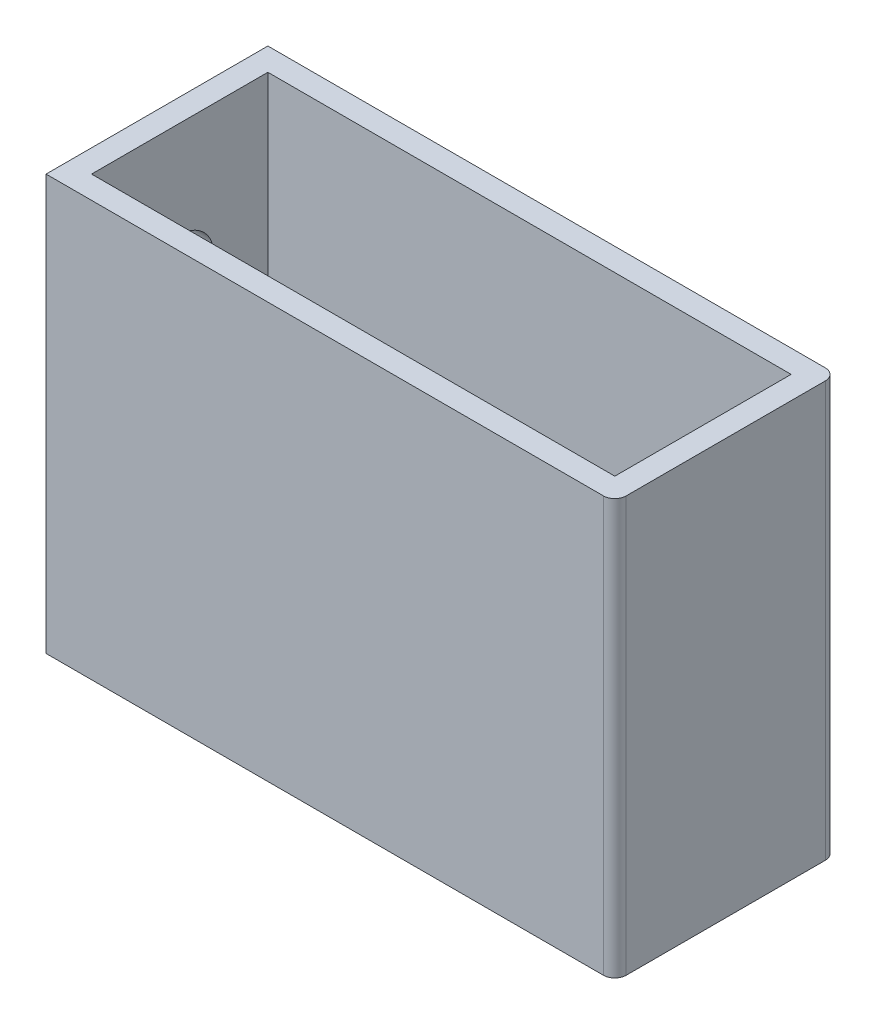
ISO-10303-21;
HEADER;
FILE_DESCRIPTION(('STEP AP214'),'2;1');
FILE_NAME('part.step','',(''),(''),'','','');
FILE_SCHEMA(('AUTOMOTIVE_DESIGN { 1 0 10303 214 1 1 1 1 }'));
ENDSEC;
DATA;
#1=APPLICATION_CONTEXT('core data for automotive mechanical design processes');
#2=APPLICATION_PROTOCOL_DEFINITION('international standard','automotive_design',2000,#1);
#3=PRODUCT_CONTEXT('',#1,'mechanical');
#4=PRODUCT('Part','Part','',(#3));
#5=PRODUCT_RELATED_PRODUCT_CATEGORY('part','',(#4));
#6=PRODUCT_DEFINITION_FORMATION('','',#4);
#7=PRODUCT_DEFINITION_CONTEXT('part definition',#1,'design');
#8=PRODUCT_DEFINITION('design','',#6,#7);
#9=PRODUCT_DEFINITION_SHAPE('','',#8);
#10=(LENGTH_UNIT() NAMED_UNIT(*) SI_UNIT(.MILLI.,.METRE.));
#11=(NAMED_UNIT(*) PLANE_ANGLE_UNIT() SI_UNIT($,.RADIAN.));
#12=(NAMED_UNIT(*) SI_UNIT($,.STERADIAN.) SOLID_ANGLE_UNIT());
#13=UNCERTAINTY_MEASURE_WITH_UNIT(LENGTH_MEASURE(1.E-05),#10,'distance_accuracy_value','');
#14=(GEOMETRIC_REPRESENTATION_CONTEXT(3) GLOBAL_UNCERTAINTY_ASSIGNED_CONTEXT((#13)) GLOBAL_UNIT_ASSIGNED_CONTEXT((#10,
#11,#12)) REPRESENTATION_CONTEXT('',''));
#15=CARTESIAN_POINT('',(0.,0.,0.));
#16=DIRECTION('',(0.,0.,1.));
#17=DIRECTION('',(1.,0.,0.));
#18=AXIS2_PLACEMENT_3D('',#15,#16,#17);
#19=CARTESIAN_POINT('',(0.,3.,0.));
#20=DIRECTION('',(0.,1.,0.));
#21=DIRECTION('',(0.,0.,1.));
#22=AXIS2_PLACEMENT_3D('',#19,#20,#21);
#23=PLANE('',#22);
#24=DIRECTION('',(0.,0.,-1.));
#25=VECTOR('',#24,1.);
#26=CARTESIAN_POINT('',(-1.64,3.,15.5));
#27=LINE('',#26,#25);
#28=CARTESIAN_POINT('',(-1.64,2.99999999999995,7.08));
#29=VERTEX_POINT('',#28);
#30=CARTESIAN_POINT('',(-1.64,3.,-15.5));
#31=VERTEX_POINT('',#30);
#32=EDGE_CURVE('E187',#29,#31,#27,.T.);
#33=ORIENTED_EDGE('',*,*,#32,.F.);
#34=DIRECTION('',(1.,0.,0.));
#35=VECTOR('',#34,1.);
#36=CARTESIAN_POINT('',(-2.14000000000001,2.99999999999995,7.08));
#37=LINE('',#36,#35);
#38=CARTESIAN_POINT('',(38.86,2.99999999999995,7.08));
#39=VERTEX_POINT('',#38);
#40=EDGE_CURVE('E171',#29,#39,#37,.T.);
#41=ORIENTED_EDGE('',*,*,#40,.T.);
#42=DIRECTION('',(0.,0.,1.));
#43=VECTOR('',#42,1.);
#44=CARTESIAN_POINT('',(38.86,3.,15.5));
#45=LINE('',#44,#43);
#46=CARTESIAN_POINT('',(38.86,3.,-15.5));
#47=VERTEX_POINT('',#46);
#48=EDGE_CURVE('E185',#47,#39,#45,.T.);
#49=ORIENTED_EDGE('',*,*,#48,.F.);
#50=DIRECTION('',(1.,0.,0.));
#51=VECTOR('',#50,1.);
#52=CARTESIAN_POINT('',(0.,3.,-15.5));
#53=LINE('',#52,#51);
#54=EDGE_CURVE('E251',#31,#47,#53,.T.);
#55=ORIENTED_EDGE('',*,*,#54,.F.);
#56=EDGE_LOOP('',(#33,#41,#49,#55));
#57=FACE_BOUND('',#56,.T.);
#58=ADVANCED_FACE('F37',(#57),#23,.T.);
#59=DIRECTION('',(-1.,0.,0.));
#60=VECTOR('',#59,1.);
#61=CARTESIAN_POINT('',(46.,2.99999999999995,9.93103564978526));
#62=LINE('',#61,#60);
#63=CARTESIAN_POINT('',(46.,2.99999999999995,9.93103564978526));
#64=VERTEX_POINT('',#63);
#65=CARTESIAN_POINT('',(-8.78,2.99999999999995,9.93103564978526));
#66=VERTEX_POINT('',#65);
#67=EDGE_CURVE('E469',#64,#66,#62,.T.);
#68=ORIENTED_EDGE('',*,*,#67,.T.);
#69=DIRECTION('',(0.,0.,1.));
#70=VECTOR('',#69,1.);
#71=CARTESIAN_POINT('',(-8.78,3.,15.5));
#72=LINE('',#71,#70);
#73=CARTESIAN_POINT('',(-8.78,3.,-15.5));
#74=VERTEX_POINT('',#73);
#75=EDGE_CURVE('E443',#74,#66,#72,.T.);
#76=ORIENTED_EDGE('',*,*,#75,.F.);
#77=CARTESIAN_POINT('',(-46.,3.,-15.5));
#78=VERTEX_POINT('',#77);
#79=EDGE_CURVE('E252',#78,#74,#53,.T.);
#80=ORIENTED_EDGE('',*,*,#79,.F.);
#81=DIRECTION('',(0.,0.,1.));
#82=VECTOR('',#81,1.);
#83=CARTESIAN_POINT('',(-46.,3.,0.));
#84=LINE('',#83,#82);
#85=CARTESIAN_POINT('',(-46.,3.,15.5));
#86=VERTEX_POINT('',#85);
#87=EDGE_CURVE('E254',#78,#86,#84,.T.);
#88=ORIENTED_EDGE('',*,*,#87,.T.);
#89=DIRECTION('',(1.,0.,0.));
#90=VECTOR('',#89,1.);
#91=CARTESIAN_POINT('',(0.,3.,15.5));
#92=LINE('',#91,#90);
#93=CARTESIAN_POINT('',(46.,2.99999999999995,15.5));
#94=VERTEX_POINT('',#93);
#95=EDGE_CURVE('E256',#86,#94,#92,.T.);
#96=ORIENTED_EDGE('',*,*,#95,.T.);
#97=DIRECTION('',(0.,0.,-1.));
#98=VECTOR('',#97,1.);
#99=CARTESIAN_POINT('',(46.,2.99999999999995,15.5));
#100=LINE('',#99,#98);
#101=EDGE_CURVE('E464',#94,#64,#100,.T.);
#102=ORIENTED_EDGE('',*,*,#101,.T.);
#103=EDGE_LOOP('',(#68,#76,#80,#88,#96,#102));
#104=FACE_BOUND('',#103,.T.);
#105=ADVANCED_FACE('F312',(#104),#23,.T.);
#106=CARTESIAN_POINT('',(38.86,31.,15.5));
#107=DIRECTION('',(1.,0.,0.));
#108=DIRECTION('',(0.,0.,-1.));
#109=AXIS2_PLACEMENT_3D('',#106,#107,#108);
#110=PLANE('',#109);
#111=DIRECTION('',(0.,-1.,0.));
#112=VECTOR('',#111,1.);
#113=CARTESIAN_POINT('',(38.86,35.,7.08));
#114=LINE('',#113,#112);
#115=CARTESIAN_POINT('',(38.86,31.,7.08));
#116=VERTEX_POINT('',#115);
#117=EDGE_CURVE('E167',#116,#39,#114,.T.);
#118=ORIENTED_EDGE('',*,*,#117,.F.);
#119=DIRECTION('',(0.,0.,1.));
#120=VECTOR('',#119,1.);
#121=CARTESIAN_POINT('',(38.86,31.,15.5));
#122=LINE('',#121,#120);
#123=CARTESIAN_POINT('',(38.86,31.,-15.5));
#124=VERTEX_POINT('',#123);
#125=EDGE_CURVE('E201',#124,#116,#122,.T.);
#126=ORIENTED_EDGE('',*,*,#125,.F.);
#127=DIRECTION('',(0.,-1.,0.));
#128=VECTOR('',#127,1.);
#129=CARTESIAN_POINT('',(38.86,31.,-15.5));
#130=LINE('',#129,#128);
#131=EDGE_CURVE('E191',#124,#47,#130,.T.);
#132=ORIENTED_EDGE('',*,*,#131,.T.);
#133=ORIENTED_EDGE('',*,*,#48,.T.);
#134=EDGE_LOOP('',(#118,#126,#132,#133));
#135=FACE_BOUND('',#134,.T.);
#136=ADVANCED_FACE('F190',(#135),#110,.F.);
#137=CARTESIAN_POINT('',(-1.64,31.,15.5));
#138=DIRECTION('',(-1.,0.,0.));
#139=DIRECTION('',(0.,0.,1.));
#140=AXIS2_PLACEMENT_3D('',#137,#138,#139);
#141=PLANE('',#140);
#142=DIRECTION('',(0.,1.,0.));
#143=VECTOR('',#142,1.);
#144=CARTESIAN_POINT('',(-1.64,31.,7.08));
#145=LINE('',#144,#143);
#146=CARTESIAN_POINT('',(-1.64,31.,7.08));
#147=VERTEX_POINT('',#146);
#148=EDGE_CURVE('E188',#29,#147,#145,.T.);
#149=ORIENTED_EDGE('',*,*,#148,.F.);
#150=ORIENTED_EDGE('',*,*,#32,.T.);
#151=DIRECTION('',(0.,-1.,0.));
#152=VECTOR('',#151,1.);
#153=CARTESIAN_POINT('',(-1.64,31.,-15.5));
#154=LINE('',#153,#152);
#155=CARTESIAN_POINT('',(-1.64,31.,-15.5));
#156=VERTEX_POINT('',#155);
#157=EDGE_CURVE('E451',#156,#31,#154,.T.);
#158=ORIENTED_EDGE('',*,*,#157,.F.);
#159=DIRECTION('',(0.,0.,-1.));
#160=VECTOR('',#159,1.);
#161=CARTESIAN_POINT('',(-1.64,31.,15.5));
#162=LINE('',#161,#160);
#163=EDGE_CURVE('E59',#147,#156,#162,.T.);
#164=ORIENTED_EDGE('',*,*,#163,.F.);
#165=EDGE_LOOP('',(#149,#150,#158,#164));
#166=FACE_BOUND('',#165,.T.);
#167=ADVANCED_FACE('F335',(#166),#141,.F.);
#168=CARTESIAN_POINT('',(-46.,73.,-15.5));
#169=DIRECTION('',(0.,0.,1.));
#170=DIRECTION('',(1.,0.,0.));
#171=AXIS2_PLACEMENT_3D('',#168,#169,#170);
#172=PLANE('',#171);
#173=DIRECTION('',(-1.,0.,0.));
#174=VECTOR('',#173,1.);
#175=CARTESIAN_POINT('',(-1.64,31.,-15.5));
#176=LINE('',#175,#174);
#177=CARTESIAN_POINT('',(-8.78,31.,-15.5));
#178=VERTEX_POINT('',#177);
#179=EDGE_CURVE('E442',#156,#178,#176,.T.);
#180=ORIENTED_EDGE('',*,*,#179,.F.);
#181=ORIENTED_EDGE('',*,*,#157,.T.);
#182=ORIENTED_EDGE('',*,*,#54,.T.);
#183=ORIENTED_EDGE('',*,*,#131,.F.);
#184=DIRECTION('',(-1.,0.,0.));
#185=VECTOR('',#184,1.);
#186=CARTESIAN_POINT('',(46.,31.,-15.5));
#187=LINE('',#186,#185);
#188=CARTESIAN_POINT('',(46.,31.,-15.5));
#189=VERTEX_POINT('',#188);
#190=EDGE_CURVE('E195',#189,#124,#187,.T.);
#191=ORIENTED_EDGE('',*,*,#190,.F.);
#192=DIRECTION('',(0.,-1.,0.));
#193=VECTOR('',#192,1.);
#194=CARTESIAN_POINT('',(46.,73.,-15.5));
#195=LINE('',#194,#193);
#196=CARTESIAN_POINT('',(46.,73.,-15.5));
#197=VERTEX_POINT('',#196);
#198=EDGE_CURVE('E213',#197,#189,#195,.T.);
#199=ORIENTED_EDGE('',*,*,#198,.F.);
#200=DIRECTION('',(-1.,0.,0.));
#201=VECTOR('',#200,1.);
#202=CARTESIAN_POINT('',(-46.,73.,-15.5));
#203=LINE('',#202,#201);
#204=CARTESIAN_POINT('',(-46.,73.,-15.5));
#205=VERTEX_POINT('',#204);
#206=EDGE_CURVE('E204',#197,#205,#203,.T.);
#207=ORIENTED_EDGE('',*,*,#206,.T.);
#208=DIRECTION('',(0.,-1.,0.));
#209=VECTOR('',#208,1.);
#210=CARTESIAN_POINT('',(-46.,73.,-15.5));
#211=LINE('',#210,#209);
#212=EDGE_CURVE('E222',#205,#78,#211,.T.);
#213=ORIENTED_EDGE('',*,*,#212,.T.);
#214=ORIENTED_EDGE('',*,*,#79,.T.);
#215=DIRECTION('',(0.,-1.,0.));
#216=VECTOR('',#215,1.);
#217=CARTESIAN_POINT('',(-8.78,31.,-15.5));
#218=LINE('',#217,#216);
#219=EDGE_CURVE('E52',#178,#74,#218,.T.);
#220=ORIENTED_EDGE('',*,*,#219,.F.);
#221=EDGE_LOOP('',(#180,#181,#182,#183,#191,#199,#207,#213,#214,#220));
#222=FACE_BOUND('',#221,.T.);
#223=ADVANCED_FACE('F331',(#222),#172,.T.);
#224=CARTESIAN_POINT('',(-46.,73.,15.5));
#225=DIRECTION('',(0.,0.,-1.));
#226=DIRECTION('',(-1.,0.,0.));
#227=AXIS2_PLACEMENT_3D('',#224,#225,#226);
#228=PLANE('',#227);
#229=DIRECTION('',(0.,-1.,0.));
#230=VECTOR('',#229,1.);
#231=CARTESIAN_POINT('',(46.,73.,15.5));
#232=LINE('',#231,#230);
#233=CARTESIAN_POINT('',(46.,73.,15.5));
#234=VERTEX_POINT('',#233);
#235=EDGE_CURVE('E216',#234,#94,#232,.T.);
#236=ORIENTED_EDGE('',*,*,#235,.T.);
#237=ORIENTED_EDGE('',*,*,#95,.F.);
#238=DIRECTION('',(0.,-1.,0.));
#239=VECTOR('',#238,1.);
#240=CARTESIAN_POINT('',(-46.,73.,15.5));
#241=LINE('',#240,#239);
#242=CARTESIAN_POINT('',(-46.,73.,15.5));
#243=VERTEX_POINT('',#242);
#244=EDGE_CURVE('E219',#243,#86,#241,.T.);
#245=ORIENTED_EDGE('',*,*,#244,.F.);
#246=DIRECTION('',(1.,0.,0.));
#247=VECTOR('',#246,1.);
#248=CARTESIAN_POINT('',(-46.,73.,15.5));
#249=LINE('',#248,#247);
#250=EDGE_CURVE('E208',#243,#234,#249,.T.);
#251=ORIENTED_EDGE('',*,*,#250,.T.);
#252=EDGE_LOOP('',(#236,#237,#245,#251));
#253=FACE_BOUND('',#252,.T.);
#254=ADVANCED_FACE('F334',(#253),#228,.T.);
#255=CARTESIAN_POINT('',(46.,73.,-15.5));
#256=DIRECTION('',(-1.,0.,0.));
#257=DIRECTION('',(0.,0.,1.));
#258=AXIS2_PLACEMENT_3D('',#255,#256,#257);
#259=PLANE('',#258);
#260=DIRECTION('',(0.,0.,-1.));
#261=VECTOR('',#260,1.);
#262=CARTESIAN_POINT('',(46.,35.,0.));
#263=LINE('',#262,#261);
#264=CARTESIAN_POINT('',(46.,35.,9.93103564978525));
#265=VERTEX_POINT('',#264);
#266=CARTESIAN_POINT('',(46.,35.,7.08));
#267=VERTEX_POINT('',#266);
#268=EDGE_CURVE('E474',#265,#267,#263,.T.);
#269=ORIENTED_EDGE('',*,*,#268,.F.);
#270=DIRECTION('',(0.,-1.,0.));
#271=VECTOR('',#270,1.);
#272=CARTESIAN_POINT('',(46.,35.,9.93103564978526));
#273=LINE('',#272,#271);
#274=EDGE_CURVE('E193',#265,#64,#273,.T.);
#275=ORIENTED_EDGE('',*,*,#274,.T.);
#276=ORIENTED_EDGE('',*,*,#101,.F.);
#277=ORIENTED_EDGE('',*,*,#235,.F.);
#278=DIRECTION('',(0.,0.,-1.));
#279=VECTOR('',#278,1.);
#280=CARTESIAN_POINT('',(46.,73.,-15.5));
#281=LINE('',#280,#279);
#282=EDGE_CURVE('E211',#234,#197,#281,.T.);
#283=ORIENTED_EDGE('',*,*,#282,.T.);
#284=ORIENTED_EDGE('',*,*,#198,.T.);
#285=DIRECTION('',(0.,0.,-1.));
#286=VECTOR('',#285,1.);
#287=CARTESIAN_POINT('',(46.,31.,15.5));
#288=LINE('',#287,#286);
#289=CARTESIAN_POINT('',(46.,31.,7.08));
#290=VERTEX_POINT('',#289);
#291=EDGE_CURVE('E192',#290,#189,#288,.T.);
#292=ORIENTED_EDGE('',*,*,#291,.F.);
#293=DIRECTION('',(0.,-1.,0.));
#294=VECTOR('',#293,1.);
#295=CARTESIAN_POINT('',(46.,35.,7.08));
#296=LINE('',#295,#294);
#297=EDGE_CURVE('E197',#267,#290,#296,.T.);
#298=ORIENTED_EDGE('',*,*,#297,.F.);
#299=EDGE_LOOP('',(#269,#275,#276,#277,#283,#284,#292,#298));
#300=FACE_BOUND('',#299,.T.);
#301=ADVANCED_FACE('F330',(#300),#259,.T.);
#302=CARTESIAN_POINT('',(0.,73.,0.));
#303=DIRECTION('',(0.,1.,0.));
#304=DIRECTION('',(0.,0.,1.));
#305=AXIS2_PLACEMENT_3D('',#302,#303,#304);
#306=PLANE('',#305);
#307=DIRECTION('',(0.,0.,-1.));
#308=VECTOR('',#307,1.);
#309=CARTESIAN_POINT('',(50.,73.,-19.5));
#310=LINE('',#309,#308);
#311=CARTESIAN_POINT('',(50.,73.,17.5));
#312=VERTEX_POINT('',#311);
#313=CARTESIAN_POINT('',(50.,73.,-17.5));
#314=VERTEX_POINT('',#313);
#315=EDGE_CURVE('E226',#312,#314,#310,.T.);
#316=ORIENTED_EDGE('',*,*,#315,.T.);
#317=CARTESIAN_POINT('',(48.,73.,-17.5));
#318=DIRECTION('',(0.,1.,0.));
#319=DIRECTION('',(0.,0.,1.));
#320=AXIS2_PLACEMENT_3D('',#317,#318,#319);
#321=CIRCLE('',#320,2.);
#322=CARTESIAN_POINT('',(48.,73.,-19.5));
#323=VERTEX_POINT('',#322);
#324=EDGE_CURVE('E11',#314,#323,#321,.T.);
#325=ORIENTED_EDGE('',*,*,#324,.T.);
#326=DIRECTION('',(-1.,0.,0.));
#327=VECTOR('',#326,1.);
#328=CARTESIAN_POINT('',(-50.,73.,-19.5));
#329=LINE('',#328,#327);
#330=CARTESIAN_POINT('',(-50.,73.,-19.5));
#331=VERTEX_POINT('',#330);
#332=EDGE_CURVE('E229',#323,#331,#329,.T.);
#333=ORIENTED_EDGE('',*,*,#332,.T.);
#334=DIRECTION('',(0.,0.,1.));
#335=VECTOR('',#334,1.);
#336=CARTESIAN_POINT('',(-50.,73.,-19.5));
#337=LINE('',#336,#335);
#338=CARTESIAN_POINT('',(-50.,73.,19.5));
#339=VERTEX_POINT('',#338);
#340=EDGE_CURVE('E232',#331,#339,#337,.T.);
#341=ORIENTED_EDGE('',*,*,#340,.T.);
#342=DIRECTION('',(1.,0.,0.));
#343=VECTOR('',#342,1.);
#344=CARTESIAN_POINT('',(-50.,73.,19.5));
#345=LINE('',#344,#343);
#346=CARTESIAN_POINT('',(48.,73.,19.5));
#347=VERTEX_POINT('',#346);
#348=EDGE_CURVE('E234',#339,#347,#345,.T.);
#349=ORIENTED_EDGE('',*,*,#348,.T.);
#350=CARTESIAN_POINT('',(48.,73.,17.5));
#351=DIRECTION('',(0.,1.,0.));
#352=DIRECTION('',(0.,0.,1.));
#353=AXIS2_PLACEMENT_3D('',#350,#351,#352);
#354=CIRCLE('',#353,2.);
#355=EDGE_CURVE('E265',#347,#312,#354,.T.);
#356=ORIENTED_EDGE('',*,*,#355,.T.);
#357=EDGE_LOOP('',(#316,#325,#333,#341,#349,#356));
#358=FACE_BOUND('',#357,.T.);
#359=DIRECTION('',(0.,0.,1.));
#360=VECTOR('',#359,1.);
#361=CARTESIAN_POINT('',(-46.,73.,-15.5));
#362=LINE('',#361,#360);
#363=EDGE_CURVE('E206',#205,#243,#362,.T.);
#364=ORIENTED_EDGE('',*,*,#363,.F.);
#365=ORIENTED_EDGE('',*,*,#206,.F.);
#366=ORIENTED_EDGE('',*,*,#282,.F.);
#367=ORIENTED_EDGE('',*,*,#250,.F.);
#368=EDGE_LOOP('',(#364,#365,#366,#367));
#369=FACE_BOUND('',#368,.T.);
#370=ADVANCED_FACE('F280',(#358,#369),#306,.T.);
#371=CARTESIAN_POINT('',(50.,73.,-19.5));
#372=DIRECTION('',(-1.,0.,0.));
#373=DIRECTION('',(0.,0.,1.));
#374=AXIS2_PLACEMENT_3D('',#371,#372,#373);
#375=PLANE('',#374);
#376=DIRECTION('',(0.,0.,-1.));
#377=VECTOR('',#376,1.);
#378=CARTESIAN_POINT('',(50.,0.,-19.5));
#379=LINE('',#378,#377);
#380=CARTESIAN_POINT('',(50.,0.,17.5));
#381=VERTEX_POINT('',#380);
#382=CARTESIAN_POINT('',(50.,0.,-17.5));
#383=VERTEX_POINT('',#382);
#384=EDGE_CURVE('E225',#381,#383,#379,.T.);
#385=ORIENTED_EDGE('',*,*,#384,.T.);
#386=DIRECTION('',(0.,-1.,0.));
#387=VECTOR('',#386,1.);
#388=CARTESIAN_POINT('',(50.,73.,-17.5));
#389=LINE('',#388,#387);
#390=EDGE_CURVE('E45',#383,#314,#389,.F.);
#391=ORIENTED_EDGE('',*,*,#390,.T.);
#392=ORIENTED_EDGE('',*,*,#315,.F.);
#393=DIRECTION('',(0.,-1.,0.));
#394=VECTOR('',#393,1.);
#395=CARTESIAN_POINT('',(50.,73.,17.5));
#396=LINE('',#395,#394);
#397=EDGE_CURVE('E258',#312,#381,#396,.T.);
#398=ORIENTED_EDGE('',*,*,#397,.T.);
#399=EDGE_LOOP('',(#385,#391,#392,#398));
#400=FACE_BOUND('',#399,.T.);
#401=ADVANCED_FACE('F274',(#400),#375,.F.);
#402=CARTESIAN_POINT('',(-50.,73.,-19.5));
#403=DIRECTION('',(0.,0.,1.));
#404=DIRECTION('',(1.,0.,0.));
#405=AXIS2_PLACEMENT_3D('',#402,#403,#404);
#406=PLANE('',#405);
#407=ORIENTED_EDGE('',*,*,#332,.F.);
#408=DIRECTION('',(0.,-1.,0.));
#409=VECTOR('',#408,1.);
#410=CARTESIAN_POINT('',(48.,73.,-19.5));
#411=LINE('',#410,#409);
#412=CARTESIAN_POINT('',(48.,0.,-19.5));
#413=VERTEX_POINT('',#412);
#414=EDGE_CURVE('E267',#323,#413,#411,.T.);
#415=ORIENTED_EDGE('',*,*,#414,.T.);
#416=DIRECTION('',(-1.,0.,0.));
#417=VECTOR('',#416,1.);
#418=CARTESIAN_POINT('',(-50.,0.,-19.5));
#419=LINE('',#418,#417);
#420=CARTESIAN_POINT('',(-50.,0.,-19.5));
#421=VERTEX_POINT('',#420);
#422=EDGE_CURVE('E240',#413,#421,#419,.T.);
#423=ORIENTED_EDGE('',*,*,#422,.T.);
#424=DIRECTION('',(0.,-1.,0.));
#425=VECTOR('',#424,1.);
#426=CARTESIAN_POINT('',(-50.,73.,-19.5));
#427=LINE('',#426,#425);
#428=EDGE_CURVE('E248',#331,#421,#427,.T.);
#429=ORIENTED_EDGE('',*,*,#428,.F.);
#430=EDGE_LOOP('',(#407,#415,#423,#429));
#431=FACE_BOUND('',#430,.T.);
#432=ADVANCED_FACE('F287',(#431),#406,.F.);
#433=CARTESIAN_POINT('',(-50.,73.,-19.5));
#434=DIRECTION('',(1.,0.,0.));
#435=DIRECTION('',(0.,0.,-1.));
#436=AXIS2_PLACEMENT_3D('',#433,#434,#435);
#437=PLANE('',#436);
#438=CARTESIAN_POINT('',(-50.,50.,0.));
#439=DIRECTION('',(1.,0.,0.));
#440=DIRECTION('',(0.,0.,-1.));
#441=AXIS2_PLACEMENT_3D('',#438,#439,#440);
#442=CIRCLE('',#441,6.);
#443=CARTESIAN_POINT('',(-50.,50.,-6.));
#444=VERTEX_POINT('',#443);
#445=EDGE_CURVE('E179',#444,#444,#442,.T.);
#446=ORIENTED_EDGE('',*,*,#445,.T.);
#447=EDGE_LOOP('',(#446));
#448=FACE_BOUND('',#447,.T.);
#449=DIRECTION('',(0.,0.,1.));
#450=VECTOR('',#449,1.);
#451=CARTESIAN_POINT('',(-50.,0.,-19.5));
#452=LINE('',#451,#450);
#453=CARTESIAN_POINT('',(-50.,0.,19.5));
#454=VERTEX_POINT('',#453);
#455=EDGE_CURVE('E242',#421,#454,#452,.T.);
#456=ORIENTED_EDGE('',*,*,#455,.T.);
#457=DIRECTION('',(0.,-1.,0.));
#458=VECTOR('',#457,1.);
#459=CARTESIAN_POINT('',(-50.,73.,19.5));
#460=LINE('',#459,#458);
#461=EDGE_CURVE('E237',#339,#454,#460,.T.);
#462=ORIENTED_EDGE('',*,*,#461,.F.);
#463=ORIENTED_EDGE('',*,*,#340,.F.);
#464=ORIENTED_EDGE('',*,*,#428,.T.);
#465=EDGE_LOOP('',(#456,#462,#463,#464));
#466=FACE_BOUND('',#465,.T.);
#467=ADVANCED_FACE('F295',(#448,#466),#437,.F.);
#468=CARTESIAN_POINT('',(-50.,73.,19.5));
#469=DIRECTION('',(0.,0.,-1.));
#470=DIRECTION('',(-1.,0.,0.));
#471=AXIS2_PLACEMENT_3D('',#468,#469,#470);
#472=PLANE('',#471);
#473=DIRECTION('',(1.,0.,0.));
#474=VECTOR('',#473,1.);
#475=CARTESIAN_POINT('',(-50.,0.,19.5));
#476=LINE('',#475,#474);
#477=CARTESIAN_POINT('',(48.,0.,19.5));
#478=VERTEX_POINT('',#477);
#479=EDGE_CURVE('E230',#454,#478,#476,.T.);
#480=ORIENTED_EDGE('',*,*,#479,.T.);
#481=DIRECTION('',(0.,-1.,0.));
#482=VECTOR('',#481,1.);
#483=CARTESIAN_POINT('',(48.,73.,19.5));
#484=LINE('',#483,#482);
#485=EDGE_CURVE('E263',#478,#347,#484,.F.);
#486=ORIENTED_EDGE('',*,*,#485,.T.);
#487=ORIENTED_EDGE('',*,*,#348,.F.);
#488=ORIENTED_EDGE('',*,*,#461,.T.);
#489=EDGE_LOOP('',(#480,#486,#487,#488));
#490=FACE_BOUND('',#489,.T.);
#491=ADVANCED_FACE('F299',(#490),#472,.F.);
#492=CARTESIAN_POINT('',(-46.,73.,-15.5));
#493=DIRECTION('',(1.,0.,0.));
#494=DIRECTION('',(0.,0.,-1.));
#495=AXIS2_PLACEMENT_3D('',#492,#493,#494);
#496=PLANE('',#495);
#497=CARTESIAN_POINT('',(-46.,50.,0.));
#498=DIRECTION('',(1.,0.,0.));
#499=DIRECTION('',(0.,0.,-1.));
#500=AXIS2_PLACEMENT_3D('',#497,#498,#499);
#501=CIRCLE('',#500,6.);
#502=CARTESIAN_POINT('',(-46.,50.,-6.));
#503=VERTEX_POINT('',#502);
#504=EDGE_CURVE('E411',#503,#503,#501,.T.);
#505=ORIENTED_EDGE('',*,*,#504,.F.);
#506=EDGE_LOOP('',(#505));
#507=FACE_BOUND('',#506,.T.);
#508=ORIENTED_EDGE('',*,*,#244,.T.);
#509=ORIENTED_EDGE('',*,*,#87,.F.);
#510=ORIENTED_EDGE('',*,*,#212,.F.);
#511=ORIENTED_EDGE('',*,*,#363,.T.);
#512=EDGE_LOOP('',(#508,#509,#510,#511));
#513=FACE_BOUND('',#512,.T.);
#514=ADVANCED_FACE('F309',(#507,#513),#496,.T.);
#515=CARTESIAN_POINT('',(0.,0.,0.));
#516=DIRECTION('',(0.,1.,0.));
#517=DIRECTION('',(0.,0.,1.));
#518=AXIS2_PLACEMENT_3D('',#515,#516,#517);
#519=PLANE('',#518);
#520=ORIENTED_EDGE('',*,*,#422,.F.);
#521=CARTESIAN_POINT('',(48.,0.,-17.5));
#522=DIRECTION('',(0.,1.,0.));
#523=DIRECTION('',(0.,0.,1.));
#524=AXIS2_PLACEMENT_3D('',#521,#522,#523);
#525=CIRCLE('',#524,2.);
#526=EDGE_CURVE('E270',#413,#383,#525,.F.);
#527=ORIENTED_EDGE('',*,*,#526,.T.);
#528=ORIENTED_EDGE('',*,*,#384,.F.);
#529=CARTESIAN_POINT('',(48.,0.,17.5));
#530=DIRECTION('',(0.,1.,0.));
#531=DIRECTION('',(0.,0.,1.));
#532=AXIS2_PLACEMENT_3D('',#529,#530,#531);
#533=CIRCLE('',#532,2.);
#534=EDGE_CURVE('E261',#381,#478,#533,.F.);
#535=ORIENTED_EDGE('',*,*,#534,.T.);
#536=ORIENTED_EDGE('',*,*,#479,.F.);
#537=ORIENTED_EDGE('',*,*,#455,.F.);
#538=EDGE_LOOP('',(#520,#527,#528,#535,#536,#537));
#539=FACE_BOUND('',#538,.T.);
#540=ADVANCED_FACE('F291',(#539),#519,.F.);
#541=CARTESIAN_POINT('',(48.,73.,17.5));
#542=DIRECTION('',(0.,-1.,0.));
#543=DIRECTION('',(0.,0.,-1.));
#544=AXIS2_PLACEMENT_3D('',#541,#542,#543);
#545=CYLINDRICAL_SURFACE('',#544,2.);
#546=ORIENTED_EDGE('',*,*,#355,.F.);
#547=ORIENTED_EDGE('',*,*,#485,.F.);
#548=ORIENTED_EDGE('',*,*,#534,.F.);
#549=ORIENTED_EDGE('',*,*,#397,.F.);
#550=EDGE_LOOP('',(#546,#547,#548,#549));
#551=FACE_BOUND('',#550,.T.);
#552=ADVANCED_FACE('F302',(#551),#545,.T.);
#553=CARTESIAN_POINT('',(48.,73.,-17.5));
#554=DIRECTION('',(0.,-1.,0.));
#555=DIRECTION('',(0.,0.,-1.));
#556=AXIS2_PLACEMENT_3D('',#553,#554,#555);
#557=CYLINDRICAL_SURFACE('',#556,2.);
#558=ORIENTED_EDGE('',*,*,#324,.F.);
#559=ORIENTED_EDGE('',*,*,#390,.F.);
#560=ORIENTED_EDGE('',*,*,#526,.F.);
#561=ORIENTED_EDGE('',*,*,#414,.F.);
#562=EDGE_LOOP('',(#558,#559,#560,#561));
#563=FACE_BOUND('',#562,.T.);
#564=ADVANCED_FACE('F39',(#563),#557,.T.);
#565=CARTESIAN_POINT('',(0.,31.,0.));
#566=DIRECTION('',(0.,1.,0.));
#567=DIRECTION('',(0.,0.,1.));
#568=AXIS2_PLACEMENT_3D('',#565,#566,#567);
#569=PLANE('',#568);
#570=CARTESIAN_POINT('',(43.36,31.,-8.92));
#571=DIRECTION('',(0.,1.,0.));
#572=DIRECTION('',(0.,0.,1.));
#573=AXIS2_PLACEMENT_3D('',#570,#571,#572);
#574=CIRCLE('',#573,0.499999999999999);
#575=CARTESIAN_POINT('',(43.36,31.,-8.42000000000001));
#576=VERTEX_POINT('',#575);
#577=EDGE_CURVE('E455',#576,#576,#574,.T.);
#578=ORIENTED_EDGE('',*,*,#577,.F.);
#579=EDGE_LOOP('',(#578));
#580=FACE_BOUND('',#579,.T.);
#581=CARTESIAN_POINT('',(43.36,31.,1.07999999999999));
#582=DIRECTION('',(0.,1.,0.));
#583=DIRECTION('',(0.,0.,1.));
#584=AXIS2_PLACEMENT_3D('',#581,#582,#583);
#585=CIRCLE('',#584,0.499999999999999);
#586=CARTESIAN_POINT('',(43.36,31.,1.57999999999999));
#587=VERTEX_POINT('',#586);
#588=EDGE_CURVE('E458',#587,#587,#585,.T.);
#589=ORIENTED_EDGE('',*,*,#588,.F.);
#590=EDGE_LOOP('',(#589));
#591=FACE_BOUND('',#590,.T.);
#592=DIRECTION('',(1.,0.,0.));
#593=VECTOR('',#592,1.);
#594=CARTESIAN_POINT('',(0.,31.,7.08));
#595=LINE('',#594,#593);
#596=EDGE_CURVE('E174',#116,#290,#595,.T.);
#597=ORIENTED_EDGE('',*,*,#596,.T.);
#598=ORIENTED_EDGE('',*,*,#291,.T.);
#599=ORIENTED_EDGE('',*,*,#190,.T.);
#600=ORIENTED_EDGE('',*,*,#125,.T.);
#601=EDGE_LOOP('',(#597,#598,#599,#600));
#602=FACE_BOUND('',#601,.T.);
#603=ADVANCED_FACE('F308',(#580,#591,#602),#569,.T.);
#604=CARTESIAN_POINT('',(0.,35.,9.93103564978526));
#605=DIRECTION('',(0.,0.,-1.));
#606=DIRECTION('',(-1.,0.,0.));
#607=AXIS2_PLACEMENT_3D('',#604,#605,#606);
#608=PLANE('',#607);
#609=DIRECTION('',(1.,0.,0.));
#610=VECTOR('',#609,1.);
#611=CARTESIAN_POINT('',(0.,35.,9.93103564978526));
#612=LINE('',#611,#610);
#613=CARTESIAN_POINT('',(-8.78,35.,9.93103564978526));
#614=VERTEX_POINT('',#613);
#615=EDGE_CURVE('E471',#614,#265,#612,.T.);
#616=ORIENTED_EDGE('',*,*,#615,.F.);
#617=DIRECTION('',(0.,-1.,0.));
#618=VECTOR('',#617,1.);
#619=CARTESIAN_POINT('',(-8.78,35.,9.93103564978526));
#620=LINE('',#619,#618);
#621=EDGE_CURVE('E438',#614,#66,#620,.T.);
#622=ORIENTED_EDGE('',*,*,#621,.T.);
#623=ORIENTED_EDGE('',*,*,#67,.F.);
#624=ORIENTED_EDGE('',*,*,#274,.F.);
#625=EDGE_LOOP('',(#616,#622,#623,#624));
#626=FACE_BOUND('',#625,.T.);
#627=ADVANCED_FACE('F349',(#626),#608,.F.);
#628=CARTESIAN_POINT('',(0.,35.,7.08));
#629=DIRECTION('',(0.,0.,-1.));
#630=DIRECTION('',(-1.,0.,0.));
#631=AXIS2_PLACEMENT_3D('',#628,#629,#630);
#632=PLANE('',#631);
#633=ORIENTED_EDGE('',*,*,#596,.F.);
#634=ORIENTED_EDGE('',*,*,#117,.T.);
#635=ORIENTED_EDGE('',*,*,#40,.F.);
#636=ORIENTED_EDGE('',*,*,#148,.T.);
#637=DIRECTION('',(1.,0.,0.));
#638=VECTOR('',#637,1.);
#639=CARTESIAN_POINT('',(-47.64,31.,7.08));
#640=LINE('',#639,#638);
#641=CARTESIAN_POINT('',(-8.78,31.,7.08));
#642=VERTEX_POINT('',#641);
#643=EDGE_CURVE('E428',#642,#147,#640,.T.);
#644=ORIENTED_EDGE('',*,*,#643,.F.);
#645=DIRECTION('',(0.,-1.,0.));
#646=VECTOR('',#645,1.);
#647=CARTESIAN_POINT('',(-8.78,35.,7.08));
#648=LINE('',#647,#646);
#649=CARTESIAN_POINT('',(-8.78,35.,7.08));
#650=VERTEX_POINT('',#649);
#651=EDGE_CURVE('E434',#650,#642,#648,.T.);
#652=ORIENTED_EDGE('',*,*,#651,.F.);
#653=DIRECTION('',(1.,0.,0.));
#654=VECTOR('',#653,1.);
#655=CARTESIAN_POINT('',(0.,35.,7.08));
#656=LINE('',#655,#654);
#657=EDGE_CURVE('E477',#650,#267,#656,.T.);
#658=ORIENTED_EDGE('',*,*,#657,.T.);
#659=ORIENTED_EDGE('',*,*,#297,.T.);
#660=EDGE_LOOP('',(#633,#634,#635,#636,#644,#652,#658,#659));
#661=FACE_BOUND('',#660,.T.);
#662=ADVANCED_FACE('F169',(#661),#632,.T.);
#663=CARTESIAN_POINT('',(0.,35.,0.));
#664=DIRECTION('',(0.,1.,0.));
#665=DIRECTION('',(0.,0.,1.));
#666=AXIS2_PLACEMENT_3D('',#663,#664,#665);
#667=PLANE('',#666);
#668=ORIENTED_EDGE('',*,*,#657,.F.);
#669=DIRECTION('',(0.,0.,1.));
#670=VECTOR('',#669,1.);
#671=CARTESIAN_POINT('',(-8.78,35.,0.));
#672=LINE('',#671,#670);
#673=EDGE_CURVE('E431',#650,#614,#672,.T.);
#674=ORIENTED_EDGE('',*,*,#673,.T.);
#675=ORIENTED_EDGE('',*,*,#615,.T.);
#676=ORIENTED_EDGE('',*,*,#268,.T.);
#677=EDGE_LOOP('',(#668,#674,#675,#676));
#678=FACE_BOUND('',#677,.T.);
#679=ADVANCED_FACE('F356',(#678),#667,.T.);
#680=CARTESIAN_POINT('',(43.36,11.,1.07999999999999));
#681=DIRECTION('',(0.,1.,0.));
#682=DIRECTION('',(0.,0.,1.));
#683=AXIS2_PLACEMENT_3D('',#680,#681,#682);
#684=CYLINDRICAL_SURFACE('',#683,0.499999999999999);
#685=CARTESIAN_POINT('',(43.36,11.,1.07999999999999));
#686=DIRECTION('',(0.,1.,0.));
#687=DIRECTION('',(0.,0.,1.));
#688=AXIS2_PLACEMENT_3D('',#685,#686,#687);
#689=CIRCLE('',#688,0.499999999999999);
#690=CARTESIAN_POINT('',(43.36,11.,1.57999999999999));
#691=VERTEX_POINT('',#690);
#692=EDGE_CURVE('E461',#691,#691,#689,.T.);
#693=ORIENTED_EDGE('',*,*,#692,.F.);
#694=EDGE_LOOP('',(#693));
#695=FACE_BOUND('',#694,.T.);
#696=ORIENTED_EDGE('',*,*,#588,.T.);
#697=EDGE_LOOP('',(#696));
#698=FACE_BOUND('',#697,.T.);
#699=ADVANCED_FACE('F359',(#695,#698),#684,.F.);
#700=CARTESIAN_POINT('',(43.36,11.,1.07999999999999));
#701=DIRECTION('',(0.,1.,0.));
#702=DIRECTION('',(0.,0.,1.));
#703=AXIS2_PLACEMENT_3D('',#700,#701,#702);
#704=PLANE('',#703);
#705=ORIENTED_EDGE('',*,*,#692,.T.);
#706=EDGE_LOOP('',(#705));
#707=FACE_BOUND('',#706,.T.);
#708=ADVANCED_FACE('F363',(#707),#704,.T.);
#709=CARTESIAN_POINT('',(43.36,11.,-8.92));
#710=DIRECTION('',(0.,1.,0.));
#711=DIRECTION('',(0.,0.,1.));
#712=AXIS2_PLACEMENT_3D('',#709,#710,#711);
#713=CYLINDRICAL_SURFACE('',#712,0.499999999999999);
#714=CARTESIAN_POINT('',(43.36,11.,-8.92));
#715=DIRECTION('',(0.,1.,0.));
#716=DIRECTION('',(0.,0.,1.));
#717=AXIS2_PLACEMENT_3D('',#714,#715,#716);
#718=CIRCLE('',#717,0.499999999999999);
#719=CARTESIAN_POINT('',(43.36,11.,-8.42000000000001));
#720=VERTEX_POINT('',#719);
#721=EDGE_CURVE('E454',#720,#720,#718,.T.);
#722=ORIENTED_EDGE('',*,*,#721,.F.);
#723=EDGE_LOOP('',(#722));
#724=FACE_BOUND('',#723,.T.);
#725=ORIENTED_EDGE('',*,*,#577,.T.);
#726=EDGE_LOOP('',(#725));
#727=FACE_BOUND('',#726,.T.);
#728=ADVANCED_FACE('F367',(#724,#727),#713,.F.);
#729=CARTESIAN_POINT('',(43.36,11.,-8.92));
#730=DIRECTION('',(0.,1.,0.));
#731=DIRECTION('',(0.,0.,1.));
#732=AXIS2_PLACEMENT_3D('',#729,#730,#731);
#733=PLANE('',#732);
#734=ORIENTED_EDGE('',*,*,#721,.T.);
#735=EDGE_LOOP('',(#734));
#736=FACE_BOUND('',#735,.T.);
#737=ADVANCED_FACE('F369',(#736),#733,.T.);
#738=CARTESIAN_POINT('',(-8.78,31.,15.5));
#739=DIRECTION('',(1.,0.,0.));
#740=DIRECTION('',(0.,0.,-1.));
#741=AXIS2_PLACEMENT_3D('',#738,#739,#740);
#742=PLANE('',#741);
#743=ORIENTED_EDGE('',*,*,#75,.T.);
#744=ORIENTED_EDGE('',*,*,#621,.F.);
#745=ORIENTED_EDGE('',*,*,#673,.F.);
#746=ORIENTED_EDGE('',*,*,#651,.T.);
#747=DIRECTION('',(0.,0.,1.));
#748=VECTOR('',#747,1.);
#749=CARTESIAN_POINT('',(-8.78,31.,15.5));
#750=LINE('',#749,#748);
#751=EDGE_CURVE('E445',#178,#642,#750,.T.);
#752=ORIENTED_EDGE('',*,*,#751,.F.);
#753=ORIENTED_EDGE('',*,*,#219,.T.);
#754=EDGE_LOOP('',(#743,#744,#745,#746,#752,#753));
#755=FACE_BOUND('',#754,.T.);
#756=ADVANCED_FACE('F372',(#755),#742,.F.);
#757=CARTESIAN_POINT('',(-47.64,31.,0.));
#758=DIRECTION('',(0.,1.,0.));
#759=DIRECTION('',(0.,0.,1.));
#760=AXIS2_PLACEMENT_3D('',#757,#758,#759);
#761=PLANE('',#760);
#762=CARTESIAN_POINT('',(-5.64,31.,-8.92));
#763=DIRECTION('',(0.,1.,0.));
#764=DIRECTION('',(0.,0.,1.));
#765=AXIS2_PLACEMENT_3D('',#762,#763,#764);
#766=CIRCLE('',#765,0.499999999999999);
#767=CARTESIAN_POINT('',(-5.64,31.,-8.42000000000001));
#768=VERTEX_POINT('',#767);
#769=EDGE_CURVE('E418',#768,#768,#766,.T.);
#770=ORIENTED_EDGE('',*,*,#769,.F.);
#771=EDGE_LOOP('',(#770));
#772=FACE_BOUND('',#771,.T.);
#773=CARTESIAN_POINT('',(-5.63999999999999,31.,1.07999999999999));
#774=DIRECTION('',(0.,1.,0.));
#775=DIRECTION('',(0.,0.,1.));
#776=AXIS2_PLACEMENT_3D('',#773,#774,#775);
#777=CIRCLE('',#776,0.499999999999999);
#778=CARTESIAN_POINT('',(-5.63999999999999,31.,1.57999999999999));
#779=VERTEX_POINT('',#778);
#780=EDGE_CURVE('E422',#779,#779,#777,.T.);
#781=ORIENTED_EDGE('',*,*,#780,.F.);
#782=EDGE_LOOP('',(#781));
#783=FACE_BOUND('',#782,.T.);
#784=ORIENTED_EDGE('',*,*,#643,.T.);
#785=ORIENTED_EDGE('',*,*,#163,.T.);
#786=ORIENTED_EDGE('',*,*,#179,.T.);
#787=ORIENTED_EDGE('',*,*,#751,.T.);
#788=EDGE_LOOP('',(#784,#785,#786,#787));
#789=FACE_BOUND('',#788,.T.);
#790=ADVANCED_FACE('F382',(#772,#783,#789),#761,.T.);
#791=CARTESIAN_POINT('',(-5.63999999999999,11.,1.07999999999999));
#792=DIRECTION('',(0.,1.,0.));
#793=DIRECTION('',(0.,0.,1.));
#794=AXIS2_PLACEMENT_3D('',#791,#792,#793);
#795=CYLINDRICAL_SURFACE('',#794,0.499999999999999);
#796=CARTESIAN_POINT('',(-5.63999999999999,11.,1.07999999999999));
#797=DIRECTION('',(0.,1.,0.));
#798=DIRECTION('',(0.,0.,1.));
#799=AXIS2_PLACEMENT_3D('',#796,#797,#798);
#800=CIRCLE('',#799,0.499999999999999);
#801=CARTESIAN_POINT('',(-5.63999999999999,11.,1.57999999999999));
#802=VERTEX_POINT('',#801);
#803=EDGE_CURVE('E425',#802,#802,#800,.T.);
#804=ORIENTED_EDGE('',*,*,#803,.F.);
#805=EDGE_LOOP('',(#804));
#806=FACE_BOUND('',#805,.T.);
#807=ORIENTED_EDGE('',*,*,#780,.T.);
#808=EDGE_LOOP('',(#807));
#809=FACE_BOUND('',#808,.T.);
#810=ADVANCED_FACE('F386',(#806,#809),#795,.F.);
#811=CARTESIAN_POINT('',(-5.63999999999999,11.,1.07999999999999));
#812=DIRECTION('',(0.,1.,0.));
#813=DIRECTION('',(0.,0.,1.));
#814=AXIS2_PLACEMENT_3D('',#811,#812,#813);
#815=PLANE('',#814);
#816=ORIENTED_EDGE('',*,*,#803,.T.);
#817=EDGE_LOOP('',(#816));
#818=FACE_BOUND('',#817,.T.);
#819=ADVANCED_FACE('F390',(#818),#815,.T.);
#820=CARTESIAN_POINT('',(-5.64,11.,-8.92));
#821=DIRECTION('',(0.,1.,0.));
#822=DIRECTION('',(0.,0.,1.));
#823=AXIS2_PLACEMENT_3D('',#820,#821,#822);
#824=CYLINDRICAL_SURFACE('',#823,0.499999999999999);
#825=CARTESIAN_POINT('',(-5.64,11.,-8.92));
#826=DIRECTION('',(0.,1.,0.));
#827=DIRECTION('',(0.,0.,1.));
#828=AXIS2_PLACEMENT_3D('',#825,#826,#827);
#829=CIRCLE('',#828,0.499999999999999);
#830=CARTESIAN_POINT('',(-5.64,11.,-8.42000000000001));
#831=VERTEX_POINT('',#830);
#832=EDGE_CURVE('E419',#831,#831,#829,.T.);
#833=ORIENTED_EDGE('',*,*,#832,.F.);
#834=EDGE_LOOP('',(#833));
#835=FACE_BOUND('',#834,.T.);
#836=ORIENTED_EDGE('',*,*,#769,.T.);
#837=EDGE_LOOP('',(#836));
#838=FACE_BOUND('',#837,.T.);
#839=ADVANCED_FACE('F394',(#835,#838),#824,.F.);
#840=CARTESIAN_POINT('',(-5.64,11.,-8.92));
#841=DIRECTION('',(0.,1.,0.));
#842=DIRECTION('',(0.,0.,1.));
#843=AXIS2_PLACEMENT_3D('',#840,#841,#842);
#844=PLANE('',#843);
#845=ORIENTED_EDGE('',*,*,#832,.T.);
#846=EDGE_LOOP('',(#845));
#847=FACE_BOUND('',#846,.T.);
#848=ADVANCED_FACE('F398',(#847),#844,.T.);
#849=CARTESIAN_POINT('',(-56.,50.,0.));
#850=DIRECTION('',(1.,0.,0.));
#851=DIRECTION('',(0.,0.,-1.));
#852=AXIS2_PLACEMENT_3D('',#849,#850,#851);
#853=CYLINDRICAL_SURFACE('',#852,6.);
#854=ORIENTED_EDGE('',*,*,#504,.T.);
#855=EDGE_LOOP('',(#854));
#856=FACE_BOUND('',#855,.T.);
#857=ORIENTED_EDGE('',*,*,#445,.F.);
#858=EDGE_LOOP('',(#857));
#859=FACE_BOUND('',#858,.T.);
#860=ADVANCED_FACE('F402',(#856,#859),#853,.F.);
#861=CLOSED_SHELL('',(#58,#105,#136,#167,#223,#254,#301,#370,#401,#432,#467,#491,#514,#540,#552,
#564,#603,#627,#662,#679,#699,#708,#728,#737,#756,#790,#810,#819,#839,#848,#860));
#862=MANIFOLD_SOLID_BREP('B2',#861);
#863=ADVANCED_BREP_SHAPE_REPRESENTATION('',(#18,#862),#14);
#864=SHAPE_DEFINITION_REPRESENTATION(#9,#863);
ENDSEC;
END-ISO-10303-21;
